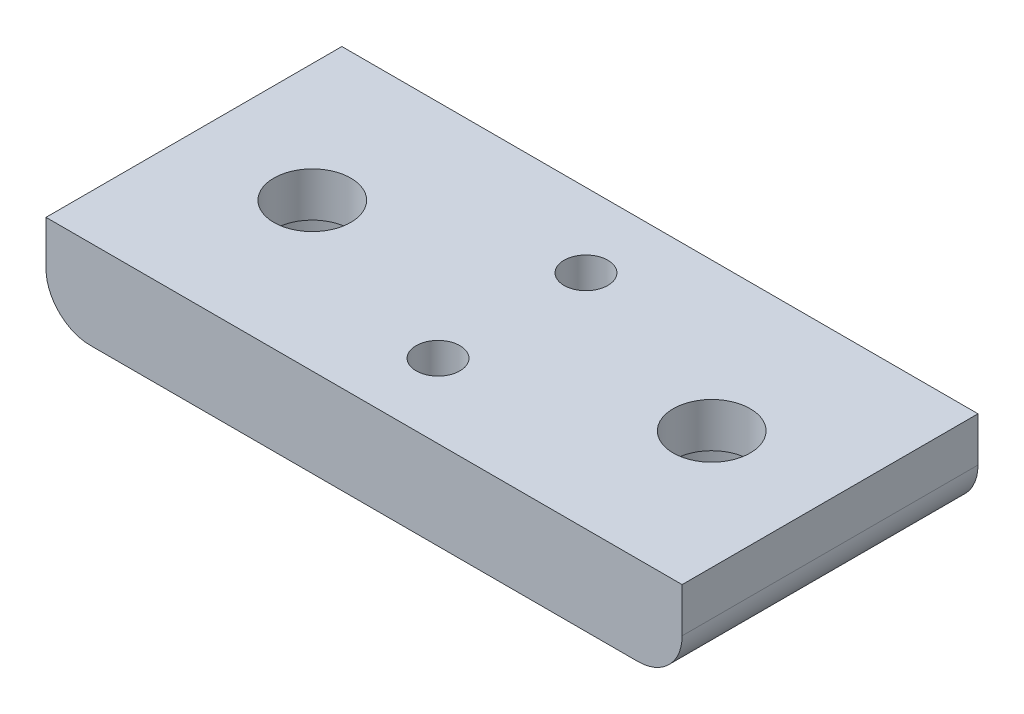
ISO-10303-21;
HEADER;
FILE_DESCRIPTION(('STEP AP214'),'2;1');
FILE_NAME('part.step','',(''),(''),'','','');
FILE_SCHEMA(('AUTOMOTIVE_DESIGN { 1 0 10303 214 1 1 1 1 }'));
ENDSEC;
DATA;
#1=APPLICATION_CONTEXT('core data for automotive mechanical design processes');
#2=APPLICATION_PROTOCOL_DEFINITION('international standard','automotive_design',2000,#1);
#3=PRODUCT_CONTEXT('',#1,'mechanical');
#4=PRODUCT('Part','Part','',(#3));
#5=PRODUCT_RELATED_PRODUCT_CATEGORY('part','',(#4));
#6=PRODUCT_DEFINITION_FORMATION('','',#4);
#7=PRODUCT_DEFINITION_CONTEXT('part definition',#1,'design');
#8=PRODUCT_DEFINITION('design','',#6,#7);
#9=PRODUCT_DEFINITION_SHAPE('','',#8);
#10=(LENGTH_UNIT() NAMED_UNIT(*) SI_UNIT(.MILLI.,.METRE.));
#11=(NAMED_UNIT(*) PLANE_ANGLE_UNIT() SI_UNIT($,.RADIAN.));
#12=(NAMED_UNIT(*) SI_UNIT($,.STERADIAN.) SOLID_ANGLE_UNIT());
#13=UNCERTAINTY_MEASURE_WITH_UNIT(LENGTH_MEASURE(1.E-05),#10,'distance_accuracy_value','');
#14=(GEOMETRIC_REPRESENTATION_CONTEXT(3) GLOBAL_UNCERTAINTY_ASSIGNED_CONTEXT((#13)) GLOBAL_UNIT_ASSIGNED_CONTEXT((#10,
#11,#12)) REPRESENTATION_CONTEXT('',''));
#15=CARTESIAN_POINT('',(0.,0.,0.));
#16=DIRECTION('',(0.,0.,1.));
#17=DIRECTION('',(1.,0.,0.));
#18=AXIS2_PLACEMENT_3D('',#15,#16,#17);
#19=CARTESIAN_POINT('',(35.,6.,-10.));
#20=DIRECTION('',(0.,-1.,0.));
#21=DIRECTION('',(0.,0.,-1.));
#22=AXIS2_PLACEMENT_3D('',#19,#20,#21);
#23=CYLINDRICAL_SURFACE('',#22,5.);
#24=CARTESIAN_POINT('',(35.,0.,-10.));
#25=DIRECTION('',(0.,1.,0.));
#26=DIRECTION('',(0.,0.,1.));
#27=AXIS2_PLACEMENT_3D('',#24,#25,#26);
#28=CIRCLE('',#27,5.);
#29=CARTESIAN_POINT('',(40.,0.,-10.));
#30=VERTEX_POINT('',#29);
#31=EDGE_CURVE('E180',#30,#30,#28,.T.);
#32=ORIENTED_EDGE('',*,*,#31,.F.);
#33=EDGE_LOOP('',(#32));
#34=FACE_BOUND('',#33,.T.);
#35=CARTESIAN_POINT('',(35.,3.,-10.));
#36=DIRECTION('',(0.,1.,0.));
#37=DIRECTION('',(0.,0.,1.));
#38=AXIS2_PLACEMENT_3D('',#35,#36,#37);
#39=CIRCLE('',#38,5.);
#40=CARTESIAN_POINT('',(35.,3.,-5.));
#41=VERTEX_POINT('',#40);
#42=EDGE_CURVE('E350',#41,#41,#39,.T.);
#43=ORIENTED_EDGE('',*,*,#42,.T.);
#44=EDGE_LOOP('',(#43));
#45=FACE_BOUND('',#44,.T.);
#46=ADVANCED_FACE('F39',(#34,#45),#23,.F.);
#47=CARTESIAN_POINT('',(8.,6.,-10.));
#48=DIRECTION('',(0.,-1.,0.));
#49=DIRECTION('',(0.,0.,-1.));
#50=AXIS2_PLACEMENT_3D('',#47,#48,#49);
#51=CYLINDRICAL_SURFACE('',#50,5.);
#52=CARTESIAN_POINT('',(8.,0.,-10.));
#53=DIRECTION('',(0.,1.,0.));
#54=DIRECTION('',(0.,0.,1.));
#55=AXIS2_PLACEMENT_3D('',#52,#53,#54);
#56=CIRCLE('',#55,5.);
#57=CARTESIAN_POINT('',(3.,0.,-10.));
#58=VERTEX_POINT('',#57);
#59=EDGE_CURVE('E175',#58,#58,#56,.T.);
#60=ORIENTED_EDGE('',*,*,#59,.F.);
#61=EDGE_LOOP('',(#60));
#62=FACE_BOUND('',#61,.T.);
#63=CARTESIAN_POINT('',(8.,3.,-10.));
#64=DIRECTION('',(0.,1.,0.));
#65=DIRECTION('',(0.,0.,1.));
#66=AXIS2_PLACEMENT_3D('',#63,#64,#65);
#67=CIRCLE('',#66,5.);
#68=CARTESIAN_POINT('',(8.,3.,-5.));
#69=VERTEX_POINT('',#68);
#70=EDGE_CURVE('E361',#69,#69,#67,.T.);
#71=ORIENTED_EDGE('',*,*,#70,.T.);
#72=EDGE_LOOP('',(#71));
#73=FACE_BOUND('',#72,.T.);
#74=ADVANCED_FACE('F195',(#62,#73),#51,.F.);
#75=CARTESIAN_POINT('',(0.,6.,0.));
#76=DIRECTION('',(0.,-1.,0.));
#77=DIRECTION('',(0.,0.,-1.));
#78=AXIS2_PLACEMENT_3D('',#75,#76,#77);
#79=PLANE('',#78);
#80=DIRECTION('',(0.,0.,1.));
#81=VECTOR('',#80,1.);
#82=CARTESIAN_POINT('',(0.,6.,0.));
#83=LINE('',#82,#81);
#84=CARTESIAN_POINT('',(0.,6.,-20.));
#85=VERTEX_POINT('',#84);
#86=CARTESIAN_POINT('',(0.,6.,0.));
#87=VERTEX_POINT('',#86);
#88=EDGE_CURVE('E110',#85,#87,#83,.T.);
#89=ORIENTED_EDGE('',*,*,#88,.T.);
#90=DIRECTION('',(1.,0.,0.));
#91=VECTOR('',#90,1.);
#92=CARTESIAN_POINT('',(0.,6.,0.));
#93=LINE('',#92,#91);
#94=CARTESIAN_POINT('',(43.,6.,0.));
#95=VERTEX_POINT('',#94);
#96=EDGE_CURVE('E99',#87,#95,#93,.T.);
#97=ORIENTED_EDGE('',*,*,#96,.T.);
#98=DIRECTION('',(0.,0.,-1.));
#99=VECTOR('',#98,1.);
#100=CARTESIAN_POINT('',(43.,6.,0.));
#101=LINE('',#100,#99);
#102=CARTESIAN_POINT('',(43.,6.,-20.));
#103=VERTEX_POINT('',#102);
#104=EDGE_CURVE('E109',#95,#103,#101,.T.);
#105=ORIENTED_EDGE('',*,*,#104,.T.);
#106=DIRECTION('',(-1.,0.,0.));
#107=VECTOR('',#106,1.);
#108=CARTESIAN_POINT('',(0.,6.,-20.));
#109=LINE('',#108,#107);
#110=EDGE_CURVE('E116',#103,#85,#109,.T.);
#111=ORIENTED_EDGE('',*,*,#110,.T.);
#112=EDGE_LOOP('',(#89,#97,#105,#111));
#113=FACE_BOUND('',#112,.T.);
#114=CARTESIAN_POINT('',(21.5,6.,-15.));
#115=DIRECTION('',(0.,1.,0.));
#116=DIRECTION('',(0.,0.,1.));
#117=AXIS2_PLACEMENT_3D('',#114,#115,#116);
#118=CIRCLE('',#117,1.48);
#119=CARTESIAN_POINT('',(21.5,6.,-13.52));
#120=VERTEX_POINT('',#119);
#121=EDGE_CURVE('E377',#120,#120,#118,.T.);
#122=ORIENTED_EDGE('',*,*,#121,.F.);
#123=EDGE_LOOP('',(#122));
#124=FACE_BOUND('',#123,.T.);
#125=CARTESIAN_POINT('',(21.5,6.,-5.));
#126=DIRECTION('',(0.,1.,0.));
#127=DIRECTION('',(0.,0.,1.));
#128=AXIS2_PLACEMENT_3D('',#125,#126,#127);
#129=CIRCLE('',#128,1.48);
#130=CARTESIAN_POINT('',(21.5,6.,-3.52));
#131=VERTEX_POINT('',#130);
#132=EDGE_CURVE('E369',#131,#131,#129,.T.);
#133=ORIENTED_EDGE('',*,*,#132,.F.);
#134=EDGE_LOOP('',(#133));
#135=FACE_BOUND('',#134,.T.);
#136=CARTESIAN_POINT('',(8.,6.,-10.));
#137=DIRECTION('',(0.,1.,0.));
#138=DIRECTION('',(0.,0.,1.));
#139=AXIS2_PLACEMENT_3D('',#136,#137,#138);
#140=CIRCLE('',#139,2.6);
#141=CARTESIAN_POINT('',(8.,6.,-7.4));
#142=VERTEX_POINT('',#141);
#143=EDGE_CURVE('E356',#142,#142,#140,.T.);
#144=ORIENTED_EDGE('',*,*,#143,.F.);
#145=EDGE_LOOP('',(#144));
#146=FACE_BOUND('',#145,.T.);
#147=CARTESIAN_POINT('',(35.,6.,-10.));
#148=DIRECTION('',(0.,1.,0.));
#149=DIRECTION('',(0.,0.,1.));
#150=AXIS2_PLACEMENT_3D('',#147,#148,#149);
#151=CIRCLE('',#150,2.6);
#152=CARTESIAN_POINT('',(35.,6.,-7.4));
#153=VERTEX_POINT('',#152);
#154=EDGE_CURVE('E345',#153,#153,#151,.T.);
#155=ORIENTED_EDGE('',*,*,#154,.F.);
#156=EDGE_LOOP('',(#155));
#157=FACE_BOUND('',#156,.T.);
#158=ADVANCED_FACE('F113',(#113,#124,#135,#146,#157),#79,.F.);
#159=CARTESIAN_POINT('',(0.,0.,0.));
#160=DIRECTION('',(0.,-1.,0.));
#161=DIRECTION('',(0.,0.,-1.));
#162=AXIS2_PLACEMENT_3D('',#159,#160,#161);
#163=PLANE('',#162);
#164=CARTESIAN_POINT('',(21.5,0.,-15.));
#165=DIRECTION('',(0.,1.,0.));
#166=DIRECTION('',(0.,0.,1.));
#167=AXIS2_PLACEMENT_3D('',#164,#165,#166);
#168=CIRCLE('',#167,1.48);
#169=CARTESIAN_POINT('',(21.5,0.,-13.52));
#170=VERTEX_POINT('',#169);
#171=EDGE_CURVE('E373',#170,#170,#168,.T.);
#172=ORIENTED_EDGE('',*,*,#171,.T.);
#173=EDGE_LOOP('',(#172));
#174=FACE_BOUND('',#173,.T.);
#175=DIRECTION('',(1.,0.,0.));
#176=VECTOR('',#175,1.);
#177=CARTESIAN_POINT('',(0.,0.,0.));
#178=LINE('',#177,#176);
#179=CARTESIAN_POINT('',(3.,0.,0.));
#180=VERTEX_POINT('',#179);
#181=CARTESIAN_POINT('',(40.,0.,0.));
#182=VERTEX_POINT('',#181);
#183=EDGE_CURVE('E168',#180,#182,#178,.T.);
#184=ORIENTED_EDGE('',*,*,#183,.F.);
#185=DIRECTION('',(0.,0.,1.));
#186=VECTOR('',#185,1.);
#187=CARTESIAN_POINT('',(3.,0.,-20.));
#188=LINE('',#187,#186);
#189=EDGE_CURVE('E150',#180,#58,#188,.F.);
#190=ORIENTED_EDGE('',*,*,#189,.T.);
#191=ORIENTED_EDGE('',*,*,#59,.T.);
#192=DIRECTION('',(0.,0.,1.));
#193=VECTOR('',#192,1.);
#194=CARTESIAN_POINT('',(3.,0.,-20.));
#195=LINE('',#194,#193);
#196=CARTESIAN_POINT('',(3.,0.,-20.));
#197=VERTEX_POINT('',#196);
#198=EDGE_CURVE('E147',#58,#197,#195,.F.);
#199=ORIENTED_EDGE('',*,*,#198,.T.);
#200=DIRECTION('',(-1.,0.,0.));
#201=VECTOR('',#200,1.);
#202=CARTESIAN_POINT('',(0.,0.,-20.));
#203=LINE('',#202,#201);
#204=CARTESIAN_POINT('',(40.,0.,-20.));
#205=VERTEX_POINT('',#204);
#206=EDGE_CURVE('E121',#205,#197,#203,.T.);
#207=ORIENTED_EDGE('',*,*,#206,.F.);
#208=DIRECTION('',(0.,0.,-1.));
#209=VECTOR('',#208,1.);
#210=CARTESIAN_POINT('',(40.,0.,0.));
#211=LINE('',#210,#209);
#212=EDGE_CURVE('E61',#205,#30,#211,.F.);
#213=ORIENTED_EDGE('',*,*,#212,.T.);
#214=ORIENTED_EDGE('',*,*,#31,.T.);
#215=DIRECTION('',(0.,0.,-1.));
#216=VECTOR('',#215,1.);
#217=CARTESIAN_POINT('',(40.,0.,0.));
#218=LINE('',#217,#216);
#219=EDGE_CURVE('E142',#30,#182,#218,.F.);
#220=ORIENTED_EDGE('',*,*,#219,.T.);
#221=EDGE_LOOP('',(#184,#190,#191,#199,#207,#213,#214,#220));
#222=FACE_BOUND('',#221,.T.);
#223=CARTESIAN_POINT('',(21.5,0.,-5.));
#224=DIRECTION('',(0.,1.,0.));
#225=DIRECTION('',(0.,0.,1.));
#226=AXIS2_PLACEMENT_3D('',#223,#224,#225);
#227=CIRCLE('',#226,1.48);
#228=CARTESIAN_POINT('',(21.5,0.,-3.52));
#229=VERTEX_POINT('',#228);
#230=EDGE_CURVE('E368',#229,#229,#227,.T.);
#231=ORIENTED_EDGE('',*,*,#230,.T.);
#232=EDGE_LOOP('',(#231));
#233=FACE_BOUND('',#232,.T.);
#234=ADVANCED_FACE('F170',(#174,#222,#233),#163,.T.);
#235=CARTESIAN_POINT('',(0.,6.,0.));
#236=DIRECTION('',(1.,0.,0.));
#237=DIRECTION('',(0.,0.,-1.));
#238=AXIS2_PLACEMENT_3D('',#235,#236,#237);
#239=PLANE('',#238);
#240=DIRECTION('',(0.,-1.,0.));
#241=VECTOR('',#240,1.);
#242=CARTESIAN_POINT('',(0.,6.,-20.));
#243=LINE('',#242,#241);
#244=CARTESIAN_POINT('',(0.,3.,-20.));
#245=VERTEX_POINT('',#244);
#246=EDGE_CURVE('E159',#85,#245,#243,.T.);
#247=ORIENTED_EDGE('',*,*,#246,.T.);
#248=DIRECTION('',(0.,0.,1.));
#249=VECTOR('',#248,1.);
#250=CARTESIAN_POINT('',(0.,3.,0.));
#251=LINE('',#250,#249);
#252=CARTESIAN_POINT('',(0.,3.,0.));
#253=VERTEX_POINT('',#252);
#254=EDGE_CURVE('E126',#245,#253,#251,.T.);
#255=ORIENTED_EDGE('',*,*,#254,.T.);
#256=DIRECTION('',(0.,-1.,0.));
#257=VECTOR('',#256,1.);
#258=CARTESIAN_POINT('',(0.,6.,0.));
#259=LINE('',#258,#257);
#260=EDGE_CURVE('E103',#87,#253,#259,.T.);
#261=ORIENTED_EDGE('',*,*,#260,.F.);
#262=ORIENTED_EDGE('',*,*,#88,.F.);
#263=EDGE_LOOP('',(#247,#255,#261,#262));
#264=FACE_BOUND('',#263,.T.);
#265=ADVANCED_FACE('F124',(#264),#239,.F.);
#266=CARTESIAN_POINT('',(0.,6.,0.));
#267=DIRECTION('',(0.,0.,-1.));
#268=DIRECTION('',(-1.,0.,0.));
#269=AXIS2_PLACEMENT_3D('',#266,#267,#268);
#270=PLANE('',#269);
#271=ORIENTED_EDGE('',*,*,#260,.T.);
#272=CARTESIAN_POINT('',(3.,3.,0.));
#273=DIRECTION('',(0.,0.,-1.));
#274=DIRECTION('',(-1.,0.,0.));
#275=AXIS2_PLACEMENT_3D('',#272,#273,#274);
#276=CIRCLE('',#275,3.);
#277=EDGE_CURVE('E139',#253,#180,#276,.F.);
#278=ORIENTED_EDGE('',*,*,#277,.T.);
#279=ORIENTED_EDGE('',*,*,#183,.T.);
#280=CARTESIAN_POINT('',(40.,3.,0.));
#281=DIRECTION('',(0.,0.,-1.));
#282=DIRECTION('',(-1.,0.,0.));
#283=AXIS2_PLACEMENT_3D('',#280,#281,#282);
#284=CIRCLE('',#283,3.);
#285=CARTESIAN_POINT('',(43.,3.,0.));
#286=VERTEX_POINT('',#285);
#287=EDGE_CURVE('E131',#182,#286,#284,.F.);
#288=ORIENTED_EDGE('',*,*,#287,.T.);
#289=DIRECTION('',(0.,-1.,0.));
#290=VECTOR('',#289,1.);
#291=CARTESIAN_POINT('',(43.,6.,0.));
#292=LINE('',#291,#290);
#293=EDGE_CURVE('E105',#95,#286,#292,.T.);
#294=ORIENTED_EDGE('',*,*,#293,.F.);
#295=ORIENTED_EDGE('',*,*,#96,.F.);
#296=EDGE_LOOP('',(#271,#278,#279,#288,#294,#295));
#297=FACE_BOUND('',#296,.T.);
#298=ADVANCED_FACE('F101',(#297),#270,.F.);
#299=CARTESIAN_POINT('',(43.,6.,0.));
#300=DIRECTION('',(-1.,0.,0.));
#301=DIRECTION('',(0.,0.,1.));
#302=AXIS2_PLACEMENT_3D('',#299,#300,#301);
#303=PLANE('',#302);
#304=ORIENTED_EDGE('',*,*,#293,.T.);
#305=DIRECTION('',(0.,0.,-1.));
#306=VECTOR('',#305,1.);
#307=CARTESIAN_POINT('',(43.,3.,-20.));
#308=LINE('',#307,#306);
#309=CARTESIAN_POINT('',(43.,3.,-20.));
#310=VERTEX_POINT('',#309);
#311=EDGE_CURVE('E11',#286,#310,#308,.T.);
#312=ORIENTED_EDGE('',*,*,#311,.T.);
#313=DIRECTION('',(0.,-1.,0.));
#314=VECTOR('',#313,1.);
#315=CARTESIAN_POINT('',(43.,6.,-20.));
#316=LINE('',#315,#314);
#317=EDGE_CURVE('E133',#103,#310,#316,.T.);
#318=ORIENTED_EDGE('',*,*,#317,.F.);
#319=ORIENTED_EDGE('',*,*,#104,.F.);
#320=EDGE_LOOP('',(#304,#312,#318,#319));
#321=FACE_BOUND('',#320,.T.);
#322=ADVANCED_FACE('F188',(#321),#303,.F.);
#323=CARTESIAN_POINT('',(0.,6.,-20.));
#324=DIRECTION('',(0.,0.,1.));
#325=DIRECTION('',(1.,0.,0.));
#326=AXIS2_PLACEMENT_3D('',#323,#324,#325);
#327=PLANE('',#326);
#328=ORIENTED_EDGE('',*,*,#206,.T.);
#329=CARTESIAN_POINT('',(3.,3.,-20.));
#330=DIRECTION('',(0.,0.,1.));
#331=DIRECTION('',(1.,0.,0.));
#332=AXIS2_PLACEMENT_3D('',#329,#330,#331);
#333=CIRCLE('',#332,3.);
#334=EDGE_CURVE('E48',#197,#245,#333,.F.);
#335=ORIENTED_EDGE('',*,*,#334,.T.);
#336=ORIENTED_EDGE('',*,*,#246,.F.);
#337=ORIENTED_EDGE('',*,*,#110,.F.);
#338=ORIENTED_EDGE('',*,*,#317,.T.);
#339=CARTESIAN_POINT('',(40.,3.,-20.));
#340=DIRECTION('',(0.,0.,1.));
#341=DIRECTION('',(1.,0.,0.));
#342=AXIS2_PLACEMENT_3D('',#339,#340,#341);
#343=CIRCLE('',#342,3.);
#344=EDGE_CURVE('E55',#310,#205,#343,.F.);
#345=ORIENTED_EDGE('',*,*,#344,.T.);
#346=EDGE_LOOP('',(#328,#335,#336,#337,#338,#345));
#347=FACE_BOUND('',#346,.T.);
#348=ADVANCED_FACE('F158',(#347),#327,.F.);
#349=CARTESIAN_POINT('',(21.5,6.,-15.));
#350=DIRECTION('',(0.,-1.,0.));
#351=DIRECTION('',(0.,0.,-1.));
#352=AXIS2_PLACEMENT_3D('',#349,#350,#351);
#353=CYLINDRICAL_SURFACE('',#352,1.48);
#354=ORIENTED_EDGE('',*,*,#121,.T.);
#355=EDGE_LOOP('',(#354));
#356=FACE_BOUND('',#355,.T.);
#357=ORIENTED_EDGE('',*,*,#171,.F.);
#358=EDGE_LOOP('',(#357));
#359=FACE_BOUND('',#358,.T.);
#360=ADVANCED_FACE('F206',(#356,#359),#353,.F.);
#361=CARTESIAN_POINT('',(21.5,6.,-5.));
#362=DIRECTION('',(0.,-1.,0.));
#363=DIRECTION('',(0.,0.,-1.));
#364=AXIS2_PLACEMENT_3D('',#361,#362,#363);
#365=CYLINDRICAL_SURFACE('',#364,1.48);
#366=ORIENTED_EDGE('',*,*,#132,.T.);
#367=EDGE_LOOP('',(#366));
#368=FACE_BOUND('',#367,.T.);
#369=ORIENTED_EDGE('',*,*,#230,.F.);
#370=EDGE_LOOP('',(#369));
#371=FACE_BOUND('',#370,.T.);
#372=ADVANCED_FACE('F244',(#368,#371),#365,.F.);
#373=CARTESIAN_POINT('',(8.,3.,-10.));
#374=DIRECTION('',(0.,1.,0.));
#375=DIRECTION('',(0.,0.,1.));
#376=AXIS2_PLACEMENT_3D('',#373,#374,#375);
#377=PLANE('',#376);
#378=CARTESIAN_POINT('',(8.,3.,-10.));
#379=DIRECTION('',(0.,1.,0.));
#380=DIRECTION('',(0.,0.,1.));
#381=AXIS2_PLACEMENT_3D('',#378,#379,#380);
#382=CIRCLE('',#381,2.6);
#383=CARTESIAN_POINT('',(8.,3.,-7.4));
#384=VERTEX_POINT('',#383);
#385=EDGE_CURVE('E357',#384,#384,#382,.T.);
#386=ORIENTED_EDGE('',*,*,#385,.T.);
#387=EDGE_LOOP('',(#386));
#388=FACE_BOUND('',#387,.T.);
#389=ORIENTED_EDGE('',*,*,#70,.F.);
#390=EDGE_LOOP('',(#389));
#391=FACE_BOUND('',#390,.T.);
#392=ADVANCED_FACE('F251',(#388,#391),#377,.F.);
#393=CARTESIAN_POINT('',(8.,3.,-10.));
#394=DIRECTION('',(0.,1.,0.));
#395=DIRECTION('',(0.,0.,1.));
#396=AXIS2_PLACEMENT_3D('',#393,#394,#395);
#397=CYLINDRICAL_SURFACE('',#396,2.6);
#398=ORIENTED_EDGE('',*,*,#385,.F.);
#399=EDGE_LOOP('',(#398));
#400=FACE_BOUND('',#399,.T.);
#401=ORIENTED_EDGE('',*,*,#143,.T.);
#402=EDGE_LOOP('',(#401));
#403=FACE_BOUND('',#402,.T.);
#404=ADVANCED_FACE('F259',(#400,#403),#397,.F.);
#405=CARTESIAN_POINT('',(35.,3.,-10.));
#406=DIRECTION('',(0.,1.,0.));
#407=DIRECTION('',(0.,0.,1.));
#408=AXIS2_PLACEMENT_3D('',#405,#406,#407);
#409=PLANE('',#408);
#410=CARTESIAN_POINT('',(35.,3.,-10.));
#411=DIRECTION('',(0.,1.,0.));
#412=DIRECTION('',(0.,0.,1.));
#413=AXIS2_PLACEMENT_3D('',#410,#411,#412);
#414=CIRCLE('',#413,2.6);
#415=CARTESIAN_POINT('',(35.,3.,-7.4));
#416=VERTEX_POINT('',#415);
#417=EDGE_CURVE('E342',#416,#416,#414,.T.);
#418=ORIENTED_EDGE('',*,*,#417,.T.);
#419=EDGE_LOOP('',(#418));
#420=FACE_BOUND('',#419,.T.);
#421=ORIENTED_EDGE('',*,*,#42,.F.);
#422=EDGE_LOOP('',(#421));
#423=FACE_BOUND('',#422,.T.);
#424=ADVANCED_FACE('F267',(#420,#423),#409,.F.);
#425=CARTESIAN_POINT('',(35.,3.,-10.));
#426=DIRECTION('',(0.,1.,0.));
#427=DIRECTION('',(0.,0.,1.));
#428=AXIS2_PLACEMENT_3D('',#425,#426,#427);
#429=CYLINDRICAL_SURFACE('',#428,2.6);
#430=ORIENTED_EDGE('',*,*,#417,.F.);
#431=EDGE_LOOP('',(#430));
#432=FACE_BOUND('',#431,.T.);
#433=ORIENTED_EDGE('',*,*,#154,.T.);
#434=EDGE_LOOP('',(#433));
#435=FACE_BOUND('',#434,.T.);
#436=ADVANCED_FACE('F193',(#432,#435),#429,.F.);
#437=CARTESIAN_POINT('',(3.,3.,0.));
#438=DIRECTION('',(0.,0.,-1.));
#439=DIRECTION('',(-1.,0.,0.));
#440=AXIS2_PLACEMENT_3D('',#437,#438,#439);
#441=CYLINDRICAL_SURFACE('',#440,3.);
#442=ORIENTED_EDGE('',*,*,#198,.F.);
#443=ORIENTED_EDGE('',*,*,#189,.F.);
#444=ORIENTED_EDGE('',*,*,#277,.F.);
#445=ORIENTED_EDGE('',*,*,#254,.F.);
#446=ORIENTED_EDGE('',*,*,#334,.F.);
#447=EDGE_LOOP('',(#442,#443,#444,#445,#446));
#448=FACE_BOUND('',#447,.T.);
#449=ADVANCED_FACE('F164',(#448),#441,.T.);
#450=CARTESIAN_POINT('',(40.,3.,0.));
#451=DIRECTION('',(0.,0.,1.));
#452=DIRECTION('',(1.,0.,0.));
#453=AXIS2_PLACEMENT_3D('',#450,#451,#452);
#454=CYLINDRICAL_SURFACE('',#453,3.);
#455=ORIENTED_EDGE('',*,*,#219,.F.);
#456=ORIENTED_EDGE('',*,*,#212,.F.);
#457=ORIENTED_EDGE('',*,*,#344,.F.);
#458=ORIENTED_EDGE('',*,*,#311,.F.);
#459=ORIENTED_EDGE('',*,*,#287,.F.);
#460=EDGE_LOOP('',(#455,#456,#457,#458,#459));
#461=FACE_BOUND('',#460,.T.);
#462=ADVANCED_FACE('F41',(#461),#454,.T.);
#463=CLOSED_SHELL('',(#46,#74,#158,#234,#265,#298,#322,#348,#360,#372,#392,#404,#424,#436,#449,#462));
#464=MANIFOLD_SOLID_BREP('B2',#463);
#465=ADVANCED_BREP_SHAPE_REPRESENTATION('',(#18,#464),#14);
#466=SHAPE_DEFINITION_REPRESENTATION(#9,#465);
ENDSEC;
END-ISO-10303-21;
